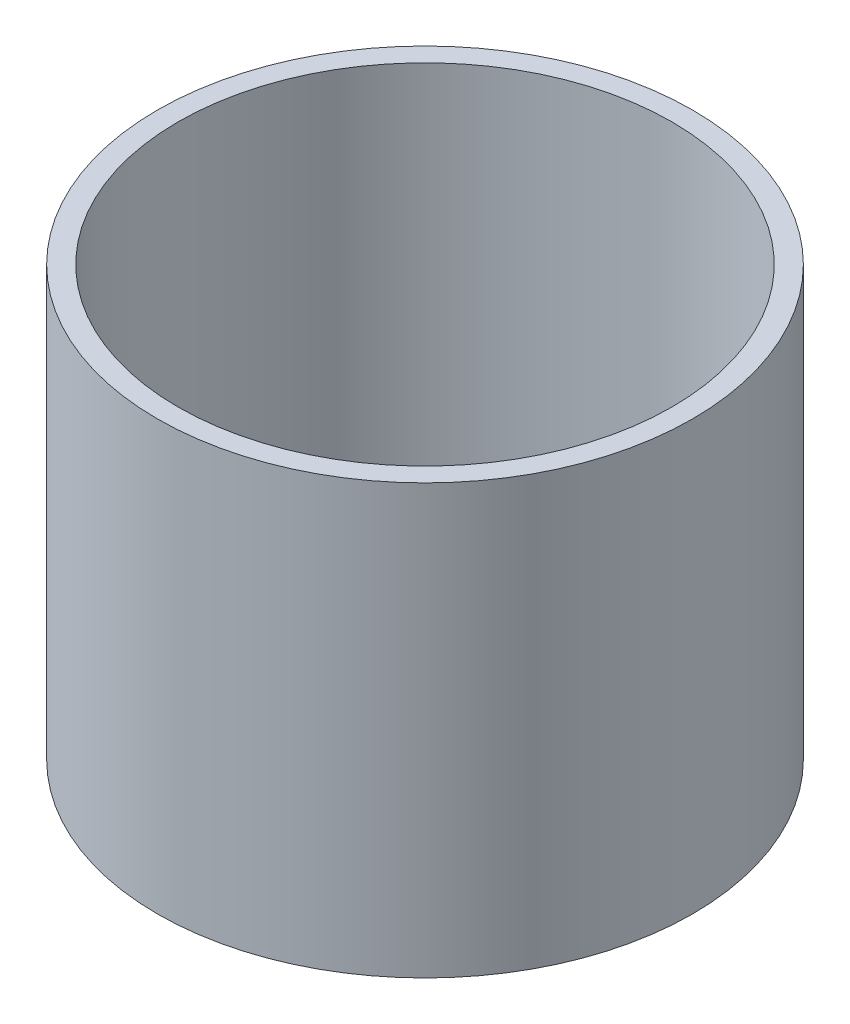
ISO-10303-21;
HEADER;
FILE_DESCRIPTION(('STEP AP214'),'2;1');
FILE_NAME('part.step','',(''),(''),'','','');
FILE_SCHEMA(('AUTOMOTIVE_DESIGN { 1 0 10303 214 1 1 1 1 }'));
ENDSEC;
DATA;
#1=APPLICATION_CONTEXT('core data for automotive mechanical design processes');
#2=APPLICATION_PROTOCOL_DEFINITION('international standard','automotive_design',2000,#1);
#3=PRODUCT_CONTEXT('',#1,'mechanical');
#4=PRODUCT('Part','Part','',(#3));
#5=PRODUCT_RELATED_PRODUCT_CATEGORY('part','',(#4));
#6=PRODUCT_DEFINITION_FORMATION('','',#4);
#7=PRODUCT_DEFINITION_CONTEXT('part definition',#1,'design');
#8=PRODUCT_DEFINITION('design','',#6,#7);
#9=PRODUCT_DEFINITION_SHAPE('','',#8);
#10=(LENGTH_UNIT() NAMED_UNIT(*) SI_UNIT(.MILLI.,.METRE.));
#11=(NAMED_UNIT(*) PLANE_ANGLE_UNIT() SI_UNIT($,.RADIAN.));
#12=(NAMED_UNIT(*) SI_UNIT($,.STERADIAN.) SOLID_ANGLE_UNIT());
#13=UNCERTAINTY_MEASURE_WITH_UNIT(LENGTH_MEASURE(1.E-05),#10,'distance_accuracy_value','');
#14=(GEOMETRIC_REPRESENTATION_CONTEXT(3) GLOBAL_UNCERTAINTY_ASSIGNED_CONTEXT((#13)) GLOBAL_UNIT_ASSIGNED_CONTEXT((#10,
#11,#12)) REPRESENTATION_CONTEXT('',''));
#15=CARTESIAN_POINT('',(0.,0.,0.));
#16=DIRECTION('',(0.,0.,1.));
#17=DIRECTION('',(1.,0.,0.));
#18=AXIS2_PLACEMENT_3D('',#15,#16,#17);
#19=CARTESIAN_POINT('',(0.,0.,0.));
#20=DIRECTION('',(0.,1.,0.));
#21=DIRECTION('',(0.,0.,1.));
#22=AXIS2_PLACEMENT_3D('',#19,#20,#21);
#23=PLANE('',#22);
#24=CARTESIAN_POINT('',(-3.27893031152525,0.,-5.02480009673629));
#25=DIRECTION('',(0.,1.,0.));
#26=DIRECTION('',(0.,0.,1.));
#27=AXIS2_PLACEMENT_3D('',#24,#25,#26);
#28=CIRCLE('',#27,1.);
#29=CARTESIAN_POINT('',(-3.27893031152525,0.,-4.02480009673629));
#30=VERTEX_POINT('',#29);
#31=EDGE_CURVE('E64',#30,#30,#28,.T.);
#32=ORIENTED_EDGE('',*,*,#31,.F.);
#33=EDGE_LOOP('',(#32));
#34=FACE_BOUND('',#33,.T.);
#35=CARTESIAN_POINT('',(5.99106968847476,0.,-0.327236898651542));
#36=DIRECTION('',(0.,-1.,0.));
#37=DIRECTION('',(0.,0.,-1.));
#38=AXIS2_PLACEMENT_3D('',#35,#36,#37);
#39=CIRCLE('',#38,1.00000000000001);
#40=CARTESIAN_POINT('',(5.99106968847476,0.,-1.32723689865155));
#41=VERTEX_POINT('',#40);
#42=EDGE_CURVE('E57',#41,#41,#39,.T.);
#43=ORIENTED_EDGE('',*,*,#42,.T.);
#44=EDGE_LOOP('',(#43));
#45=FACE_BOUND('',#44,.T.);
#46=CARTESIAN_POINT('',(0.,0.,0.));
#47=DIRECTION('',(0.,1.,0.));
#48=DIRECTION('',(0.,0.,1.));
#49=AXIS2_PLACEMENT_3D('',#46,#47,#48);
#50=CIRCLE('',#49,14.4);
#51=CARTESIAN_POINT('',(0.,0.,14.4));
#52=VERTEX_POINT('',#51);
#53=EDGE_CURVE('E10',#52,#52,#50,.F.);
#54=ORIENTED_EDGE('',*,*,#53,.F.);
#55=EDGE_LOOP('',(#54));
#56=FACE_BOUND('',#55,.T.);
#57=CARTESIAN_POINT('',(0.,0.,0.));
#58=DIRECTION('',(0.,1.,0.));
#59=DIRECTION('',(0.,0.,1.));
#60=AXIS2_PLACEMENT_3D('',#57,#58,#59);
#61=CIRCLE('',#60,4.275);
#62=CARTESIAN_POINT('',(0.,0.,4.275));
#63=VERTEX_POINT('',#62);
#64=EDGE_CURVE('E46',#63,#63,#61,.T.);
#65=ORIENTED_EDGE('',*,*,#64,.F.);
#66=EDGE_LOOP('',(#65));
#67=FACE_BOUND('',#66,.T.);
#68=CARTESIAN_POINT('',(-2.71213937694951,0.,5.35203699538783));
#69=DIRECTION('',(0.,1.,0.));
#70=DIRECTION('',(0.,0.,1.));
#71=AXIS2_PLACEMENT_3D('',#68,#69,#70);
#72=CIRCLE('',#71,0.999999999999982);
#73=CARTESIAN_POINT('',(-2.71213937694951,0.,6.35203699538781));
#74=VERTEX_POINT('',#73);
#75=EDGE_CURVE('E70',#74,#74,#72,.T.);
#76=ORIENTED_EDGE('',*,*,#75,.F.);
#77=EDGE_LOOP('',(#76));
#78=FACE_BOUND('',#77,.T.);
#79=ADVANCED_FACE('F31',(#34,#45,#56,#67,#78),#23,.T.);
#80=CARTESIAN_POINT('',(0.,-3.,0.));
#81=DIRECTION('',(0.,1.,0.));
#82=DIRECTION('',(0.,0.,1.));
#83=AXIS2_PLACEMENT_3D('',#80,#81,#82);
#84=PLANE('',#83);
#85=CARTESIAN_POINT('',(-3.27893031152525,-3.,-5.02480009673629));
#86=DIRECTION('',(0.,1.,0.));
#87=DIRECTION('',(0.,0.,1.));
#88=AXIS2_PLACEMENT_3D('',#85,#86,#87);
#89=CIRCLE('',#88,1.);
#90=CARTESIAN_POINT('',(-3.27893031152525,-3.,-4.02480009673629));
#91=VERTEX_POINT('',#90);
#92=EDGE_CURVE('E61',#91,#91,#89,.T.);
#93=ORIENTED_EDGE('',*,*,#92,.T.);
#94=EDGE_LOOP('',(#93));
#95=FACE_BOUND('',#94,.T.);
#96=CARTESIAN_POINT('',(5.99106968847476,-3.,-0.327236898651542));
#97=DIRECTION('',(0.,-1.,0.));
#98=DIRECTION('',(0.,0.,-1.));
#99=AXIS2_PLACEMENT_3D('',#96,#97,#98);
#100=CIRCLE('',#99,1.00000000000001);
#101=CARTESIAN_POINT('',(5.99106968847476,-3.,-1.32723689865155));
#102=VERTEX_POINT('',#101);
#103=EDGE_CURVE('E58',#102,#102,#100,.T.);
#104=ORIENTED_EDGE('',*,*,#103,.F.);
#105=EDGE_LOOP('',(#104));
#106=FACE_BOUND('',#105,.T.);
#107=CARTESIAN_POINT('',(0.,-3.,0.));
#108=DIRECTION('',(0.,1.,0.));
#109=DIRECTION('',(0.,0.,1.));
#110=AXIS2_PLACEMENT_3D('',#107,#108,#109);
#111=CIRCLE('',#110,15.6);
#112=CARTESIAN_POINT('',(0.,-3.,15.6));
#113=VERTEX_POINT('',#112);
#114=EDGE_CURVE('E38',#113,#113,#111,.T.);
#115=ORIENTED_EDGE('',*,*,#114,.F.);
#116=EDGE_LOOP('',(#115));
#117=FACE_BOUND('',#116,.T.);
#118=CARTESIAN_POINT('',(-2.71213937694951,-3.,5.35203699538783));
#119=DIRECTION('',(0.,1.,0.));
#120=DIRECTION('',(0.,0.,1.));
#121=AXIS2_PLACEMENT_3D('',#118,#119,#120);
#122=CIRCLE('',#121,0.999999999999982);
#123=CARTESIAN_POINT('',(-2.71213937694951,-3.,6.35203699538781));
#124=VERTEX_POINT('',#123);
#125=EDGE_CURVE('E67',#124,#124,#122,.T.);
#126=ORIENTED_EDGE('',*,*,#125,.T.);
#127=EDGE_LOOP('',(#126));
#128=FACE_BOUND('',#127,.T.);
#129=ADVANCED_FACE('F76',(#95,#106,#117,#128),#84,.F.);
#130=CARTESIAN_POINT('',(0.,-1.5,0.));
#131=DIRECTION('',(0.,1.,0.));
#132=DIRECTION('',(0.,0.,1.));
#133=AXIS2_PLACEMENT_3D('',#130,#131,#132);
#134=CYLINDRICAL_SURFACE('',#133,4.275);
#135=CARTESIAN_POINT('',(0.,-1.5,0.));
#136=DIRECTION('',(0.,1.,0.));
#137=DIRECTION('',(0.,0.,1.));
#138=AXIS2_PLACEMENT_3D('',#135,#136,#137);
#139=CIRCLE('',#138,4.275);
#140=CARTESIAN_POINT('',(0.,-1.5,4.275));
#141=VERTEX_POINT('',#140);
#142=EDGE_CURVE('E42',#141,#141,#139,.T.);
#143=ORIENTED_EDGE('',*,*,#142,.F.);
#144=EDGE_LOOP('',(#143));
#145=FACE_BOUND('',#144,.T.);
#146=ORIENTED_EDGE('',*,*,#64,.T.);
#147=EDGE_LOOP('',(#146));
#148=FACE_BOUND('',#147,.T.);
#149=ADVANCED_FACE('F94',(#145,#148),#134,.F.);
#150=CARTESIAN_POINT('',(0.,-1.5,0.));
#151=DIRECTION('',(0.,1.,0.));
#152=DIRECTION('',(0.,0.,1.));
#153=AXIS2_PLACEMENT_3D('',#150,#151,#152);
#154=PLANE('',#153);
#155=ORIENTED_EDGE('',*,*,#142,.T.);
#156=EDGE_LOOP('',(#155));
#157=FACE_BOUND('',#156,.T.);
#158=ADVANCED_FACE('F102',(#157),#154,.T.);
#159=CARTESIAN_POINT('',(0.,22.,0.));
#160=DIRECTION('',(0.,1.,0.));
#161=DIRECTION('',(0.,0.,1.));
#162=AXIS2_PLACEMENT_3D('',#159,#160,#161);
#163=PLANE('',#162);
#164=CARTESIAN_POINT('',(0.,22.,0.));
#165=DIRECTION('',(0.,1.,0.));
#166=DIRECTION('',(0.,0.,1.));
#167=AXIS2_PLACEMENT_3D('',#164,#165,#166);
#168=CIRCLE('',#167,15.6);
#169=CARTESIAN_POINT('',(0.,22.,15.6));
#170=VERTEX_POINT('',#169);
#171=EDGE_CURVE('E50',#170,#170,#168,.T.);
#172=ORIENTED_EDGE('',*,*,#171,.T.);
#173=EDGE_LOOP('',(#172));
#174=FACE_BOUND('',#173,.T.);
#175=CARTESIAN_POINT('',(0.,22.,0.));
#176=DIRECTION('',(0.,1.,0.));
#177=DIRECTION('',(0.,0.,1.));
#178=AXIS2_PLACEMENT_3D('',#175,#176,#177);
#179=CIRCLE('',#178,14.4);
#180=CARTESIAN_POINT('',(0.,22.,14.4));
#181=VERTEX_POINT('',#180);
#182=EDGE_CURVE('E54',#181,#181,#179,.T.);
#183=ORIENTED_EDGE('',*,*,#182,.F.);
#184=EDGE_LOOP('',(#183));
#185=FACE_BOUND('',#184,.T.);
#186=ADVANCED_FACE('F106',(#174,#185),#163,.T.);
#187=CARTESIAN_POINT('',(0.,22.,0.));
#188=DIRECTION('',(0.,-1.,0.));
#189=DIRECTION('',(0.,0.,-1.));
#190=AXIS2_PLACEMENT_3D('',#187,#188,#189);
#191=CYLINDRICAL_SURFACE('',#190,14.4);
#192=ORIENTED_EDGE('',*,*,#182,.T.);
#193=EDGE_LOOP('',(#192));
#194=FACE_BOUND('',#193,.T.);
#195=ORIENTED_EDGE('',*,*,#53,.T.);
#196=EDGE_LOOP('',(#195));
#197=FACE_BOUND('',#196,.T.);
#198=ADVANCED_FACE('F110',(#194,#197),#191,.F.);
#199=CARTESIAN_POINT('',(0.,-3.,0.));
#200=DIRECTION('',(0.,1.,0.));
#201=DIRECTION('',(0.,0.,1.));
#202=AXIS2_PLACEMENT_3D('',#199,#200,#201);
#203=CYLINDRICAL_SURFACE('',#202,15.6);
#204=ORIENTED_EDGE('',*,*,#114,.T.);
#205=EDGE_LOOP('',(#204));
#206=FACE_BOUND('',#205,.T.);
#207=ORIENTED_EDGE('',*,*,#171,.F.);
#208=EDGE_LOOP('',(#207));
#209=FACE_BOUND('',#208,.T.);
#210=ADVANCED_FACE('F33',(#206,#209),#203,.T.);
#211=CARTESIAN_POINT('',(5.99106968847476,0.,-0.327236898651542));
#212=DIRECTION('',(0.,-1.,0.));
#213=DIRECTION('',(0.,0.,-1.));
#214=AXIS2_PLACEMENT_3D('',#211,#212,#213);
#215=CYLINDRICAL_SURFACE('',#214,1.00000000000001);
#216=ORIENTED_EDGE('',*,*,#42,.F.);
#217=EDGE_LOOP('',(#216));
#218=FACE_BOUND('',#217,.T.);
#219=ORIENTED_EDGE('',*,*,#103,.T.);
#220=EDGE_LOOP('',(#219));
#221=FACE_BOUND('',#220,.T.);
#222=ADVANCED_FACE('F86',(#218,#221),#215,.F.);
#223=CARTESIAN_POINT('',(-3.27893031152525,0.,-5.02480009673629));
#224=DIRECTION('',(0.,-1.,0.));
#225=DIRECTION('',(0.,0.,-1.));
#226=AXIS2_PLACEMENT_3D('',#223,#224,#225);
#227=CYLINDRICAL_SURFACE('',#226,1.);
#228=ORIENTED_EDGE('',*,*,#31,.T.);
#229=EDGE_LOOP('',(#228));
#230=FACE_BOUND('',#229,.T.);
#231=ORIENTED_EDGE('',*,*,#92,.F.);
#232=EDGE_LOOP('',(#231));
#233=FACE_BOUND('',#232,.T.);
#234=ADVANCED_FACE('F80',(#230,#233),#227,.F.);
#235=CARTESIAN_POINT('',(-2.71213937694951,0.,5.35203699538783));
#236=DIRECTION('',(0.,-1.,0.));
#237=DIRECTION('',(0.,0.,-1.));
#238=AXIS2_PLACEMENT_3D('',#235,#236,#237);
#239=CYLINDRICAL_SURFACE('',#238,0.999999999999982);
#240=ORIENTED_EDGE('',*,*,#75,.T.);
#241=EDGE_LOOP('',(#240));
#242=FACE_BOUND('',#241,.T.);
#243=ORIENTED_EDGE('',*,*,#125,.F.);
#244=EDGE_LOOP('',(#243));
#245=FACE_BOUND('',#244,.T.);
#246=ADVANCED_FACE('F78',(#242,#245),#239,.F.);
#247=CLOSED_SHELL('',(#79,#129,#149,#158,#186,#198,#210,#222,#234,#246));
#248=MANIFOLD_SOLID_BREP('B2',#247);
#249=ADVANCED_BREP_SHAPE_REPRESENTATION('',(#18,#248),#14);
#250=SHAPE_DEFINITION_REPRESENTATION(#9,#249);
ENDSEC;
END-ISO-10303-21;
